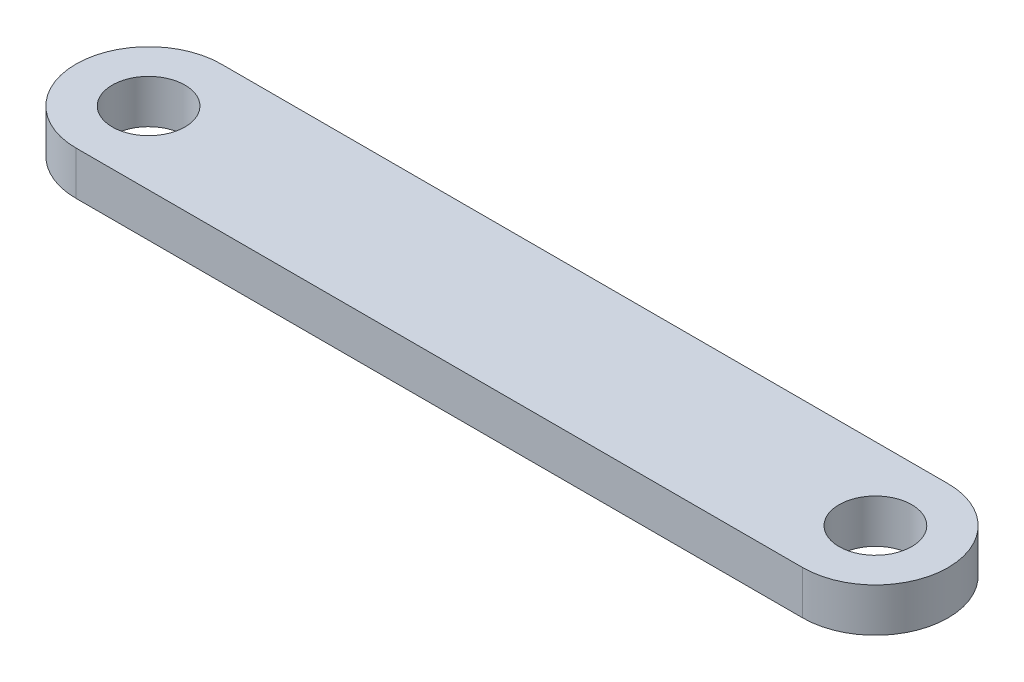
ISO-10303-21;
HEADER;
FILE_DESCRIPTION(('STEP AP214'),'2;1');
FILE_NAME('part.step','',(''),(''),'','','');
FILE_SCHEMA(('AUTOMOTIVE_DESIGN { 1 0 10303 214 1 1 1 1 }'));
ENDSEC;
DATA;
#1=APPLICATION_CONTEXT('core data for automotive mechanical design processes');
#2=APPLICATION_PROTOCOL_DEFINITION('international standard','automotive_design',2000,#1);
#3=PRODUCT_CONTEXT('',#1,'mechanical');
#4=PRODUCT('Part','Part','',(#3));
#5=PRODUCT_RELATED_PRODUCT_CATEGORY('part','',(#4));
#6=PRODUCT_DEFINITION_FORMATION('','',#4);
#7=PRODUCT_DEFINITION_CONTEXT('part definition',#1,'design');
#8=PRODUCT_DEFINITION('design','',#6,#7);
#9=PRODUCT_DEFINITION_SHAPE('','',#8);
#10=(LENGTH_UNIT() NAMED_UNIT(*) SI_UNIT(.MILLI.,.METRE.));
#11=(NAMED_UNIT(*) PLANE_ANGLE_UNIT() SI_UNIT($,.RADIAN.));
#12=(NAMED_UNIT(*) SI_UNIT($,.STERADIAN.) SOLID_ANGLE_UNIT());
#13=UNCERTAINTY_MEASURE_WITH_UNIT(LENGTH_MEASURE(1.E-05),#10,'distance_accuracy_value','');
#14=(GEOMETRIC_REPRESENTATION_CONTEXT(3) GLOBAL_UNCERTAINTY_ASSIGNED_CONTEXT((#13)) GLOBAL_UNIT_ASSIGNED_CONTEXT((#10,
#11,#12)) REPRESENTATION_CONTEXT('',''));
#15=CARTESIAN_POINT('',(0.,0.,0.));
#16=DIRECTION('',(0.,0.,1.));
#17=DIRECTION('',(1.,0.,0.));
#18=AXIS2_PLACEMENT_3D('',#15,#16,#17);
#19=CARTESIAN_POINT('',(-25.,3.,0.));
#20=DIRECTION('',(0.,1.,0.));
#21=DIRECTION('',(0.,0.,1.));
#22=AXIS2_PLACEMENT_3D('',#19,#20,#21);
#23=PLANE('',#22);
#24=CARTESIAN_POINT('',(-25.,3.,0.));
#25=DIRECTION('',(0.,1.,0.));
#26=DIRECTION('',(0.,0.,1.));
#27=AXIS2_PLACEMENT_3D('',#24,#25,#26);
#28=CIRCLE('',#27,2.5);
#29=CARTESIAN_POINT('',(-25.,3.,2.5));
#30=VERTEX_POINT('',#29);
#31=EDGE_CURVE('E99',#30,#30,#28,.T.);
#32=ORIENTED_EDGE('',*,*,#31,.F.);
#33=EDGE_LOOP('',(#32));
#34=FACE_BOUND('',#33,.T.);
#35=CARTESIAN_POINT('',(-25.,3.,0.));
#36=DIRECTION('',(0.,1.,0.));
#37=DIRECTION('',(0.,0.,1.));
#38=AXIS2_PLACEMENT_3D('',#35,#36,#37);
#39=CIRCLE('',#38,5.);
#40=CARTESIAN_POINT('',(-25.,3.,-5.));
#41=VERTEX_POINT('',#40);
#42=CARTESIAN_POINT('',(-25.,3.,5.));
#43=VERTEX_POINT('',#42);
#44=EDGE_CURVE('E84',#41,#43,#39,.T.);
#45=ORIENTED_EDGE('',*,*,#44,.T.);
#46=DIRECTION('',(1.,0.,0.));
#47=VECTOR('',#46,1.);
#48=CARTESIAN_POINT('',(-25.,3.,5.));
#49=LINE('',#48,#47);
#50=CARTESIAN_POINT('',(25.,3.,4.99999999999999));
#51=VERTEX_POINT('',#50);
#52=EDGE_CURVE('E79',#43,#51,#49,.T.);
#53=ORIENTED_EDGE('',*,*,#52,.T.);
#54=CARTESIAN_POINT('',(25.,3.,0.));
#55=DIRECTION('',(0.,1.,0.));
#56=DIRECTION('',(0.,0.,1.));
#57=AXIS2_PLACEMENT_3D('',#54,#55,#56);
#58=CIRCLE('',#57,5.);
#59=CARTESIAN_POINT('',(25.,3.,-5.00000000000001));
#60=VERTEX_POINT('',#59);
#61=EDGE_CURVE('E82',#51,#60,#58,.T.);
#62=ORIENTED_EDGE('',*,*,#61,.T.);
#63=DIRECTION('',(-1.,0.,0.));
#64=VECTOR('',#63,1.);
#65=CARTESIAN_POINT('',(-25.,3.,-5.));
#66=LINE('',#65,#64);
#67=EDGE_CURVE('E49',#60,#41,#66,.T.);
#68=ORIENTED_EDGE('',*,*,#67,.T.);
#69=EDGE_LOOP('',(#45,#53,#62,#68));
#70=FACE_BOUND('',#69,.T.);
#71=CARTESIAN_POINT('',(25.,3.,0.));
#72=DIRECTION('',(0.,1.,0.));
#73=DIRECTION('',(0.,0.,1.));
#74=AXIS2_PLACEMENT_3D('',#71,#72,#73);
#75=CIRCLE('',#74,2.5);
#76=CARTESIAN_POINT('',(25.,3.,2.49999999999999));
#77=VERTEX_POINT('',#76);
#78=EDGE_CURVE('E114',#77,#77,#75,.T.);
#79=ORIENTED_EDGE('',*,*,#78,.F.);
#80=EDGE_LOOP('',(#79));
#81=FACE_BOUND('',#80,.T.);
#82=ADVANCED_FACE('F32',(#34,#70,#81),#23,.T.);
#83=CARTESIAN_POINT('',(-25.,0.,0.));
#84=DIRECTION('',(0.,1.,0.));
#85=DIRECTION('',(0.,0.,1.));
#86=AXIS2_PLACEMENT_3D('',#83,#84,#85);
#87=PLANE('',#86);
#88=CARTESIAN_POINT('',(-25.,0.,0.));
#89=DIRECTION('',(0.,1.,0.));
#90=DIRECTION('',(0.,0.,1.));
#91=AXIS2_PLACEMENT_3D('',#88,#89,#90);
#92=CIRCLE('',#91,2.5);
#93=CARTESIAN_POINT('',(-25.,0.,2.5));
#94=VERTEX_POINT('',#93);
#95=EDGE_CURVE('E111',#94,#94,#92,.T.);
#96=ORIENTED_EDGE('',*,*,#95,.T.);
#97=EDGE_LOOP('',(#96));
#98=FACE_BOUND('',#97,.T.);
#99=CARTESIAN_POINT('',(-25.,0.,0.));
#100=DIRECTION('',(0.,1.,0.));
#101=DIRECTION('',(0.,0.,1.));
#102=AXIS2_PLACEMENT_3D('',#99,#100,#101);
#103=CIRCLE('',#102,5.);
#104=CARTESIAN_POINT('',(-25.,0.,-5.));
#105=VERTEX_POINT('',#104);
#106=CARTESIAN_POINT('',(-25.,0.,5.));
#107=VERTEX_POINT('',#106);
#108=EDGE_CURVE('E96',#105,#107,#103,.T.);
#109=ORIENTED_EDGE('',*,*,#108,.F.);
#110=DIRECTION('',(-1.,0.,0.));
#111=VECTOR('',#110,1.);
#112=CARTESIAN_POINT('',(-25.,0.,-5.));
#113=LINE('',#112,#111);
#114=CARTESIAN_POINT('',(25.,0.,-5.00000000000001));
#115=VERTEX_POINT('',#114);
#116=EDGE_CURVE('E72',#115,#105,#113,.T.);
#117=ORIENTED_EDGE('',*,*,#116,.F.);
#118=CARTESIAN_POINT('',(25.,0.,0.));
#119=DIRECTION('',(0.,1.,0.));
#120=DIRECTION('',(0.,0.,1.));
#121=AXIS2_PLACEMENT_3D('',#118,#119,#120);
#122=CIRCLE('',#121,5.);
#123=CARTESIAN_POINT('',(25.,0.,4.99999999999999));
#124=VERTEX_POINT('',#123);
#125=EDGE_CURVE('E66',#124,#115,#122,.T.);
#126=ORIENTED_EDGE('',*,*,#125,.F.);
#127=DIRECTION('',(1.,0.,0.));
#128=VECTOR('',#127,1.);
#129=CARTESIAN_POINT('',(-25.,0.,5.));
#130=LINE('',#129,#128);
#131=EDGE_CURVE('E88',#107,#124,#130,.T.);
#132=ORIENTED_EDGE('',*,*,#131,.F.);
#133=EDGE_LOOP('',(#109,#117,#126,#132));
#134=FACE_BOUND('',#133,.T.);
#135=CARTESIAN_POINT('',(25.,0.,0.));
#136=DIRECTION('',(0.,1.,0.));
#137=DIRECTION('',(0.,0.,1.));
#138=AXIS2_PLACEMENT_3D('',#135,#136,#137);
#139=CIRCLE('',#138,2.5);
#140=CARTESIAN_POINT('',(25.,0.,2.49999999999999));
#141=VERTEX_POINT('',#140);
#142=EDGE_CURVE('E117',#141,#141,#139,.T.);
#143=ORIENTED_EDGE('',*,*,#142,.T.);
#144=EDGE_LOOP('',(#143));
#145=FACE_BOUND('',#144,.T.);
#146=ADVANCED_FACE('F107',(#98,#134,#145),#87,.F.);
#147=CARTESIAN_POINT('',(-25.,3.,0.));
#148=DIRECTION('',(0.,-1.,0.));
#149=DIRECTION('',(0.,0.,-1.));
#150=AXIS2_PLACEMENT_3D('',#147,#148,#149);
#151=CYLINDRICAL_SURFACE('',#150,5.);
#152=ORIENTED_EDGE('',*,*,#108,.T.);
#153=DIRECTION('',(0.,-1.,0.));
#154=VECTOR('',#153,1.);
#155=CARTESIAN_POINT('',(-25.,3.,5.));
#156=LINE('',#155,#154);
#157=EDGE_CURVE('E11',#43,#107,#156,.T.);
#158=ORIENTED_EDGE('',*,*,#157,.F.);
#159=ORIENTED_EDGE('',*,*,#44,.F.);
#160=DIRECTION('',(0.,-1.,0.));
#161=VECTOR('',#160,1.);
#162=CARTESIAN_POINT('',(-25.,3.,-5.));
#163=LINE('',#162,#161);
#164=EDGE_CURVE('E92',#41,#105,#163,.T.);
#165=ORIENTED_EDGE('',*,*,#164,.T.);
#166=EDGE_LOOP('',(#152,#158,#159,#165));
#167=FACE_BOUND('',#166,.T.);
#168=ADVANCED_FACE('F34',(#167),#151,.T.);
#169=CARTESIAN_POINT('',(-25.,3.,5.));
#170=DIRECTION('',(0.,0.,-1.));
#171=DIRECTION('',(-1.,0.,0.));
#172=AXIS2_PLACEMENT_3D('',#169,#170,#171);
#173=PLANE('',#172);
#174=ORIENTED_EDGE('',*,*,#131,.T.);
#175=DIRECTION('',(0.,-1.,0.));
#176=VECTOR('',#175,1.);
#177=CARTESIAN_POINT('',(25.,3.,4.99999999999999));
#178=LINE('',#177,#176);
#179=EDGE_CURVE('E41',#51,#124,#178,.T.);
#180=ORIENTED_EDGE('',*,*,#179,.F.);
#181=ORIENTED_EDGE('',*,*,#52,.F.);
#182=ORIENTED_EDGE('',*,*,#157,.T.);
#183=EDGE_LOOP('',(#174,#180,#181,#182));
#184=FACE_BOUND('',#183,.T.);
#185=ADVANCED_FACE('F87',(#184),#173,.F.);
#186=CARTESIAN_POINT('',(25.,3.,0.));
#187=DIRECTION('',(0.,-1.,0.));
#188=DIRECTION('',(0.,0.,-1.));
#189=AXIS2_PLACEMENT_3D('',#186,#187,#188);
#190=CYLINDRICAL_SURFACE('',#189,5.);
#191=ORIENTED_EDGE('',*,*,#125,.T.);
#192=DIRECTION('',(0.,-1.,0.));
#193=VECTOR('',#192,1.);
#194=CARTESIAN_POINT('',(25.,3.,-5.00000000000001));
#195=LINE('',#194,#193);
#196=EDGE_CURVE('E89',#60,#115,#195,.T.);
#197=ORIENTED_EDGE('',*,*,#196,.F.);
#198=ORIENTED_EDGE('',*,*,#61,.F.);
#199=ORIENTED_EDGE('',*,*,#179,.T.);
#200=EDGE_LOOP('',(#191,#197,#198,#199));
#201=FACE_BOUND('',#200,.T.);
#202=ADVANCED_FACE('F90',(#201),#190,.T.);
#203=CARTESIAN_POINT('',(-25.,3.,-5.));
#204=DIRECTION('',(0.,0.,1.));
#205=DIRECTION('',(1.,0.,0.));
#206=AXIS2_PLACEMENT_3D('',#203,#204,#205);
#207=PLANE('',#206);
#208=ORIENTED_EDGE('',*,*,#116,.T.);
#209=ORIENTED_EDGE('',*,*,#164,.F.);
#210=ORIENTED_EDGE('',*,*,#67,.F.);
#211=ORIENTED_EDGE('',*,*,#196,.T.);
#212=EDGE_LOOP('',(#208,#209,#210,#211));
#213=FACE_BOUND('',#212,.T.);
#214=ADVANCED_FACE('F104',(#213),#207,.F.);
#215=CARTESIAN_POINT('',(-25.,3.,0.));
#216=DIRECTION('',(0.,-1.,0.));
#217=DIRECTION('',(0.,0.,-1.));
#218=AXIS2_PLACEMENT_3D('',#215,#216,#217);
#219=CYLINDRICAL_SURFACE('',#218,2.5);
#220=ORIENTED_EDGE('',*,*,#31,.T.);
#221=EDGE_LOOP('',(#220));
#222=FACE_BOUND('',#221,.T.);
#223=ORIENTED_EDGE('',*,*,#95,.F.);
#224=EDGE_LOOP('',(#223));
#225=FACE_BOUND('',#224,.T.);
#226=ADVANCED_FACE('F135',(#222,#225),#219,.F.);
#227=CARTESIAN_POINT('',(25.,3.,0.));
#228=DIRECTION('',(0.,-1.,0.));
#229=DIRECTION('',(0.,0.,-1.));
#230=AXIS2_PLACEMENT_3D('',#227,#228,#229);
#231=CYLINDRICAL_SURFACE('',#230,2.5);
#232=ORIENTED_EDGE('',*,*,#78,.T.);
#233=EDGE_LOOP('',(#232));
#234=FACE_BOUND('',#233,.T.);
#235=ORIENTED_EDGE('',*,*,#142,.F.);
#236=EDGE_LOOP('',(#235));
#237=FACE_BOUND('',#236,.T.);
#238=ADVANCED_FACE('F123',(#234,#237),#231,.F.);
#239=CLOSED_SHELL('',(#82,#146,#168,#185,#202,#214,#226,#238));
#240=MANIFOLD_SOLID_BREP('B2',#239);
#241=ADVANCED_BREP_SHAPE_REPRESENTATION('',(#18,#240),#14);
#242=SHAPE_DEFINITION_REPRESENTATION(#9,#241);
ENDSEC;
END-ISO-10303-21;
